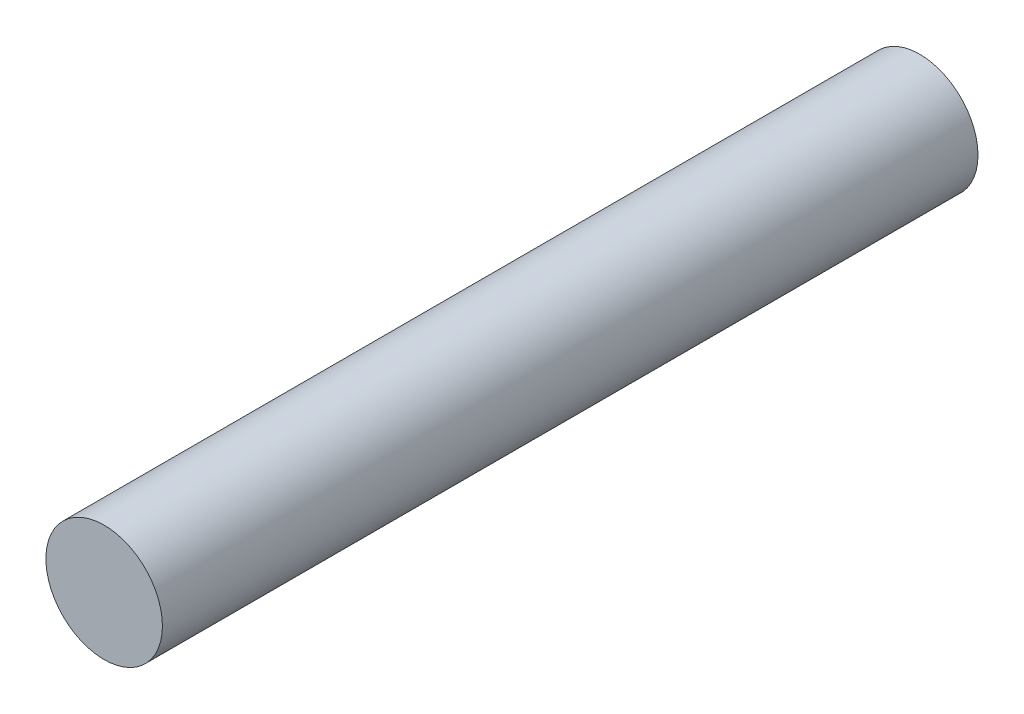
ISO-10303-21;
HEADER;
FILE_DESCRIPTION(('STEP AP214'),'2;1');
FILE_NAME('part.step','',(''),(''),'','','');
FILE_SCHEMA(('AUTOMOTIVE_DESIGN { 1 0 10303 214 1 1 1 1 }'));
ENDSEC;
DATA;
#1=APPLICATION_CONTEXT('core data for automotive mechanical design processes');
#2=APPLICATION_PROTOCOL_DEFINITION('international standard','automotive_design',2000,#1);
#3=PRODUCT_CONTEXT('',#1,'mechanical');
#4=PRODUCT('Part','Part','',(#3));
#5=PRODUCT_RELATED_PRODUCT_CATEGORY('part','',(#4));
#6=PRODUCT_DEFINITION_FORMATION('','',#4);
#7=PRODUCT_DEFINITION_CONTEXT('part definition',#1,'design');
#8=PRODUCT_DEFINITION('design','',#6,#7);
#9=PRODUCT_DEFINITION_SHAPE('','',#8);
#10=(LENGTH_UNIT() NAMED_UNIT(*) SI_UNIT(.MILLI.,.METRE.));
#11=(NAMED_UNIT(*) PLANE_ANGLE_UNIT() SI_UNIT($,.RADIAN.));
#12=(NAMED_UNIT(*) SI_UNIT($,.STERADIAN.) SOLID_ANGLE_UNIT());
#13=UNCERTAINTY_MEASURE_WITH_UNIT(LENGTH_MEASURE(1.E-05),#10,'distance_accuracy_value','');
#14=(GEOMETRIC_REPRESENTATION_CONTEXT(3) GLOBAL_UNCERTAINTY_ASSIGNED_CONTEXT((#13)) GLOBAL_UNIT_ASSIGNED_CONTEXT((#10,
#11,#12)) REPRESENTATION_CONTEXT('',''));
#15=CARTESIAN_POINT('',(0.,0.,0.));
#16=DIRECTION('',(0.,0.,1.));
#17=DIRECTION('',(1.,0.,0.));
#18=AXIS2_PLACEMENT_3D('',#15,#16,#17);
#19=CARTESIAN_POINT('',(0.,0.,889.));
#20=DIRECTION('',(0.,0.,-1.));
#21=DIRECTION('',(-1.,0.,0.));
#22=AXIS2_PLACEMENT_3D('',#19,#20,#21);
#23=CYLINDRICAL_SURFACE('',#22,63.5);
#24=CARTESIAN_POINT('',(0.,0.,889.));
#25=DIRECTION('',(0.,0.,1.));
#26=DIRECTION('',(1.,0.,0.));
#27=AXIS2_PLACEMENT_3D('',#24,#25,#26);
#28=CIRCLE('',#27,63.5);
#29=CARTESIAN_POINT('',(63.5,0.,889.));
#30=VERTEX_POINT('',#29);
#31=EDGE_CURVE('E10',#30,#30,#28,.T.);
#32=ORIENTED_EDGE('',*,*,#31,.F.);
#33=EDGE_LOOP('',(#32));
#34=FACE_BOUND('',#33,.T.);
#35=CARTESIAN_POINT('',(0.,0.,0.));
#36=DIRECTION('',(0.,0.,1.));
#37=DIRECTION('',(1.,0.,0.));
#38=AXIS2_PLACEMENT_3D('',#35,#36,#37);
#39=CIRCLE('',#38,63.5);
#40=CARTESIAN_POINT('',(63.5,0.,0.));
#41=VERTEX_POINT('',#40);
#42=EDGE_CURVE('E36',#41,#41,#39,.T.);
#43=ORIENTED_EDGE('',*,*,#42,.T.);
#44=EDGE_LOOP('',(#43));
#45=FACE_BOUND('',#44,.T.);
#46=ADVANCED_FACE('F33',(#34,#45),#23,.T.);
#47=CARTESIAN_POINT('',(0.,0.,889.));
#48=DIRECTION('',(0.,0.,1.));
#49=DIRECTION('',(1.,0.,0.));
#50=AXIS2_PLACEMENT_3D('',#47,#48,#49);
#51=PLANE('',#50);
#52=ORIENTED_EDGE('',*,*,#31,.T.);
#53=EDGE_LOOP('',(#52));
#54=FACE_BOUND('',#53,.T.);
#55=ADVANCED_FACE('F48',(#54),#51,.T.);
#56=CARTESIAN_POINT('',(0.,0.,0.));
#57=DIRECTION('',(0.,0.,1.));
#58=DIRECTION('',(1.,0.,0.));
#59=AXIS2_PLACEMENT_3D('',#56,#57,#58);
#60=PLANE('',#59);
#61=ORIENTED_EDGE('',*,*,#42,.F.);
#62=EDGE_LOOP('',(#61));
#63=FACE_BOUND('',#62,.T.);
#64=ADVANCED_FACE('F46',(#63),#60,.F.);
#65=CLOSED_SHELL('',(#46,#55,#64));
#66=MANIFOLD_SOLID_BREP('B2',#65);
#67=ADVANCED_BREP_SHAPE_REPRESENTATION('',(#18,#66),#14);
#68=SHAPE_DEFINITION_REPRESENTATION(#9,#67);
ENDSEC;
END-ISO-10303-21;
